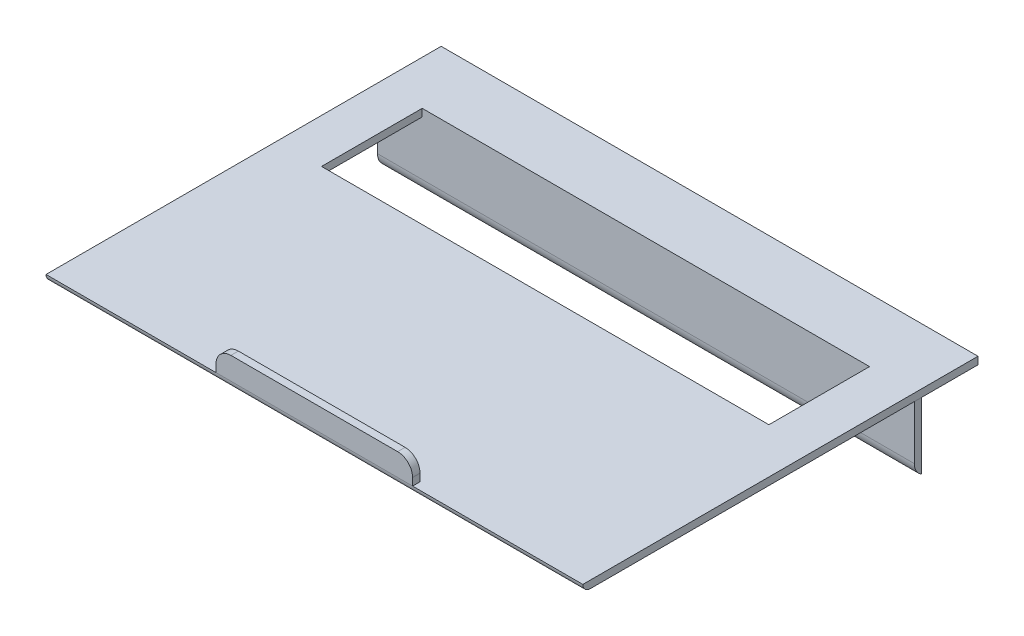
ISO-10303-21;
HEADER;
FILE_DESCRIPTION(('STEP AP214'),'2;1');
FILE_NAME('part.step','',(''),(''),'','','');
FILE_SCHEMA(('AUTOMOTIVE_DESIGN { 1 0 10303 214 1 1 1 1 }'));
ENDSEC;
DATA;
#1=APPLICATION_CONTEXT('core data for automotive mechanical design processes');
#2=APPLICATION_PROTOCOL_DEFINITION('international standard','automotive_design',2000,#1);
#3=PRODUCT_CONTEXT('',#1,'mechanical');
#4=PRODUCT('Part','Part','',(#3));
#5=PRODUCT_RELATED_PRODUCT_CATEGORY('part','',(#4));
#6=PRODUCT_DEFINITION_FORMATION('','',#4);
#7=PRODUCT_DEFINITION_CONTEXT('part definition',#1,'design');
#8=PRODUCT_DEFINITION('design','',#6,#7);
#9=PRODUCT_DEFINITION_SHAPE('','',#8);
#10=(LENGTH_UNIT() NAMED_UNIT(*) SI_UNIT(.MILLI.,.METRE.));
#11=(NAMED_UNIT(*) PLANE_ANGLE_UNIT() SI_UNIT($,.RADIAN.));
#12=(NAMED_UNIT(*) SI_UNIT($,.STERADIAN.) SOLID_ANGLE_UNIT());
#13=UNCERTAINTY_MEASURE_WITH_UNIT(LENGTH_MEASURE(1.E-05),#10,'distance_accuracy_value','');
#14=(GEOMETRIC_REPRESENTATION_CONTEXT(3) GLOBAL_UNCERTAINTY_ASSIGNED_CONTEXT((#13)) GLOBAL_UNIT_ASSIGNED_CONTEXT((#10,
#11,#12)) REPRESENTATION_CONTEXT('',''));
#15=CARTESIAN_POINT('',(0.,0.,0.));
#16=DIRECTION('',(0.,0.,1.));
#17=DIRECTION('',(1.,0.,0.));
#18=AXIS2_PLACEMENT_3D('',#15,#16,#17);
#19=CARTESIAN_POINT('',(0.0271641395676205,-1.19078061342355,2.95499944397179));
#20=DIRECTION('',(0.,-1.,0.));
#21=DIRECTION('',(0.,0.,-1.));
#22=AXIS2_PLACEMENT_3D('',#19,#20,#21);
#23=PLANE('',#22);
#24=DIRECTION('',(0.,0.,1.));
#25=VECTOR('',#24,1.);
#26=CARTESIAN_POINT('',(149.686441514181,-1.19078061342355,-94.66392061261));
#27=LINE('',#26,#25);
#28=CARTESIAN_POINT('',(149.686441514181,-1.19078061342355,-89.66392061261));
#29=VERTEX_POINT('',#28);
#30=CARTESIAN_POINT('',(149.686441514181,-1.19078061342355,-22.16392061261));
#31=VERTEX_POINT('',#30);
#32=EDGE_CURVE('E295',#29,#31,#27,.T.);
#33=ORIENTED_EDGE('',*,*,#32,.F.);
#34=DIRECTION('',(-1.,0.,0.));
#35=VECTOR('',#34,1.);
#36=CARTESIAN_POINT('',(179.686441514181,-1.19078061342355,-89.66392061261));
#37=LINE('',#36,#35);
#38=CARTESIAN_POINT('',(179.686441514181,-1.19078061342355,-89.66392061261));
#39=VERTEX_POINT('',#38);
#40=EDGE_CURVE('E195',#39,#29,#37,.T.);
#41=ORIENTED_EDGE('',*,*,#40,.F.);
#42=DIRECTION('',(0.,0.,1.));
#43=VECTOR('',#42,1.);
#44=CARTESIAN_POINT('',(179.686441514181,-1.19078061342355,-89.66392061261));
#45=LINE('',#44,#43);
#46=CARTESIAN_POINT('',(179.686441514181,-1.19078061342355,-94.66392061261));
#47=VERTEX_POINT('',#46);
#48=EDGE_CURVE('E191',#47,#39,#45,.T.);
#49=ORIENTED_EDGE('',*,*,#48,.F.);
#50=DIRECTION('',(-1.,0.,0.));
#51=VECTOR('',#50,1.);
#52=CARTESIAN_POINT('',(149.686441514181,-1.19078061342355,-94.66392061261));
#53=LINE('',#52,#51);
#54=CARTESIAN_POINT('',(-179.972835860433,-1.19078061342355,-94.66392061261));
#55=VERTEX_POINT('',#54);
#56=EDGE_CURVE('E188',#47,#55,#53,.T.);
#57=ORIENTED_EDGE('',*,*,#56,.T.);
#58=DIRECTION('',(0.,0.,1.));
#59=VECTOR('',#58,1.);
#60=CARTESIAN_POINT('',(-179.972835860433,-1.19078061342355,127.954999443972));
#61=LINE('',#60,#59);
#62=CARTESIAN_POINT('',(-179.972835860433,-1.19078061342355,-132.045000556028));
#63=VERTEX_POINT('',#62);
#64=EDGE_CURVE('E325',#63,#55,#61,.T.);
#65=ORIENTED_EDGE('',*,*,#64,.F.);
#66=DIRECTION('',(-1.,0.,0.));
#67=VECTOR('',#66,1.);
#68=CARTESIAN_POINT('',(-179.972835860433,-1.19078061342355,-132.045000556028));
#69=LINE('',#68,#67);
#70=CARTESIAN_POINT('',(180.027164139568,-1.19078061342355,-132.045000556028));
#71=VERTEX_POINT('',#70);
#72=EDGE_CURVE('E237',#71,#63,#69,.T.);
#73=ORIENTED_EDGE('',*,*,#72,.F.);
#74=DIRECTION('',(0.,0.,-1.));
#75=VECTOR('',#74,1.);
#76=CARTESIAN_POINT('',(180.027164139568,-1.19078061342355,127.954999443972));
#77=LINE('',#76,#75);
#78=CARTESIAN_POINT('',(180.027164139568,-1.19078061342355,127.954999443972));
#79=VERTEX_POINT('',#78);
#80=EDGE_CURVE('E317',#79,#71,#77,.T.);
#81=ORIENTED_EDGE('',*,*,#80,.F.);
#82=DIRECTION('',(1.,0.,0.));
#83=VECTOR('',#82,1.);
#84=CARTESIAN_POINT('',(-37.8603572812143,-1.19078061342355,127.954999443972));
#85=LINE('',#84,#83);
#86=CARTESIAN_POINT('',(-179.972835860433,-1.19078061342355,127.954999443972));
#87=VERTEX_POINT('',#86);
#88=EDGE_CURVE('E274',#87,#79,#85,.T.);
#89=ORIENTED_EDGE('',*,*,#88,.F.);
#90=CARTESIAN_POINT('',(-179.972835860433,-1.19078061342355,-89.66392061261));
#91=VERTEX_POINT('',#90);
#92=EDGE_CURVE('E335',#91,#87,#61,.T.);
#93=ORIENTED_EDGE('',*,*,#92,.F.);
#94=DIRECTION('',(1.,0.,0.));
#95=VECTOR('',#94,1.);
#96=CARTESIAN_POINT('',(-180.313558485819,-1.19078061342355,-89.66392061261));
#97=LINE('',#96,#95);
#98=CARTESIAN_POINT('',(-150.313558485819,-1.19078061342355,-89.66392061261));
#99=VERTEX_POINT('',#98);
#100=EDGE_CURVE('E216',#91,#99,#97,.T.);
#101=ORIENTED_EDGE('',*,*,#100,.T.);
#102=DIRECTION('',(0.,0.,1.));
#103=VECTOR('',#102,1.);
#104=CARTESIAN_POINT('',(-150.313558485819,-1.19078061342355,-94.66392061261));
#105=LINE('',#104,#103);
#106=CARTESIAN_POINT('',(-150.313558485819,-1.19078061342355,-22.16392061261));
#107=VERTEX_POINT('',#106);
#108=EDGE_CURVE('E305',#99,#107,#105,.T.);
#109=ORIENTED_EDGE('',*,*,#108,.T.);
#110=DIRECTION('',(-1.,0.,0.));
#111=VECTOR('',#110,1.);
#112=CARTESIAN_POINT('',(149.686441514181,-1.19078061342355,-22.16392061261));
#113=LINE('',#112,#111);
#114=EDGE_CURVE('E288',#31,#107,#113,.T.);
#115=ORIENTED_EDGE('',*,*,#114,.F.);
#116=EDGE_LOOP('',(#33,#41,#49,#57,#65,#73,#81,#89,#93,#101,#109,#115));
#117=FACE_BOUND('',#116,.T.);
#118=ADVANCED_FACE('F41',(#117),#23,.T.);
#119=CARTESIAN_POINT('',(0.0271641395676205,-1.19078061342355,132.954999443972));
#120=DIRECTION('',(0.,0.,1.));
#121=DIRECTION('',(1.,0.,0.));
#122=AXIS2_PLACEMENT_3D('',#119,#120,#121);
#123=PLANE('',#122);
#124=DIRECTION('',(1.,0.,0.));
#125=VECTOR('',#124,1.);
#126=CARTESIAN_POINT('',(-65.9736575823655,18.8092193865765,132.954999443972));
#127=LINE('',#126,#125);
#128=CARTESIAN_POINT('',(-55.9736575823655,18.8092193865765,132.954999443972));
#129=VERTEX_POINT('',#128);
#130=CARTESIAN_POINT('',(55.8576245488075,18.8092193865765,132.954999443972));
#131=VERTEX_POINT('',#130);
#132=EDGE_CURVE('E241',#129,#131,#127,.T.);
#133=ORIENTED_EDGE('',*,*,#132,.F.);
#134=CARTESIAN_POINT('',(-55.9736575823655,8.80921938657645,132.954999443972));
#135=DIRECTION('',(0.,0.,1.));
#136=DIRECTION('',(1.,0.,0.));
#137=AXIS2_PLACEMENT_3D('',#134,#135,#136);
#138=CIRCLE('',#137,10.);
#139=CARTESIAN_POINT('',(-65.9736575823655,8.80921938657645,132.954999443972));
#140=VERTEX_POINT('',#139);
#141=EDGE_CURVE('E368',#129,#140,#138,.T.);
#142=ORIENTED_EDGE('',*,*,#141,.T.);
#143=DIRECTION('',(0.,1.,0.));
#144=VECTOR('',#143,1.);
#145=CARTESIAN_POINT('',(-65.9736575823655,3.80921938657645,132.954999443972));
#146=LINE('',#145,#144);
#147=CARTESIAN_POINT('',(-65.9736575823655,3.80921938657645,132.954999443972));
#148=VERTEX_POINT('',#147);
#149=EDGE_CURVE('E253',#148,#140,#146,.T.);
#150=ORIENTED_EDGE('',*,*,#149,.F.);
#151=DIRECTION('',(1.,0.,0.));
#152=VECTOR('',#151,1.);
#153=CARTESIAN_POINT('',(0.0271641395676205,3.80921938657645,132.954999443972));
#154=LINE('',#153,#152);
#155=CARTESIAN_POINT('',(65.8576245488075,3.80921938657645,132.954999443972));
#156=VERTEX_POINT('',#155);
#157=EDGE_CURVE('E332',#148,#156,#154,.T.);
#158=ORIENTED_EDGE('',*,*,#157,.T.);
#159=DIRECTION('',(0.,-1.,0.));
#160=VECTOR('',#159,1.);
#161=CARTESIAN_POINT('',(65.8576245488075,8.80921938657645,132.954999443972));
#162=LINE('',#161,#160);
#163=CARTESIAN_POINT('',(65.8576245488075,8.80921938657645,132.954999443972));
#164=VERTEX_POINT('',#163);
#165=EDGE_CURVE('E267',#164,#156,#162,.T.);
#166=ORIENTED_EDGE('',*,*,#165,.F.);
#167=CARTESIAN_POINT('',(55.8576245488074,8.80921938657645,132.954999443972));
#168=DIRECTION('',(0.,0.,1.));
#169=DIRECTION('',(1.,0.,0.));
#170=AXIS2_PLACEMENT_3D('',#167,#168,#169);
#171=CIRCLE('',#170,10.);
#172=EDGE_CURVE('E360',#164,#131,#171,.T.);
#173=ORIENTED_EDGE('',*,*,#172,.T.);
#174=EDGE_LOOP('',(#133,#142,#150,#158,#166,#173));
#175=FACE_BOUND('',#174,.T.);
#176=ADVANCED_FACE('F411',(#175),#123,.T.);
#177=CARTESIAN_POINT('',(0.0271641395676205,-1.19078061342355,127.954999443972));
#178=DIRECTION('',(0.,0.,1.));
#179=DIRECTION('',(1.,0.,0.));
#180=AXIS2_PLACEMENT_3D('',#177,#178,#179);
#181=PLANE('',#180);
#182=DIRECTION('',(0.,1.,0.));
#183=VECTOR('',#182,1.);
#184=CARTESIAN_POINT('',(-65.9736575823655,3.80921938657645,127.954999443972));
#185=LINE('',#184,#183);
#186=CARTESIAN_POINT('',(-65.9736575823655,3.80921938657645,127.954999443972));
#187=VERTEX_POINT('',#186);
#188=CARTESIAN_POINT('',(-65.9736575823655,8.80921938657645,127.954999443972));
#189=VERTEX_POINT('',#188);
#190=EDGE_CURVE('E252',#187,#189,#185,.T.);
#191=ORIENTED_EDGE('',*,*,#190,.T.);
#192=CARTESIAN_POINT('',(-55.9736575823655,8.80921938657645,127.954999443972));
#193=DIRECTION('',(0.,0.,1.));
#194=DIRECTION('',(1.,0.,0.));
#195=AXIS2_PLACEMENT_3D('',#192,#193,#194);
#196=CIRCLE('',#195,10.);
#197=CARTESIAN_POINT('',(-55.9736575823655,18.8092193865765,127.954999443972));
#198=VERTEX_POINT('',#197);
#199=EDGE_CURVE('E374',#189,#198,#196,.F.);
#200=ORIENTED_EDGE('',*,*,#199,.T.);
#201=DIRECTION('',(-1.,0.,0.));
#202=VECTOR('',#201,1.);
#203=CARTESIAN_POINT('',(-65.9736575823655,18.8092193865765,127.954999443972));
#204=LINE('',#203,#202);
#205=CARTESIAN_POINT('',(55.8576245488075,18.8092193865765,127.954999443972));
#206=VERTEX_POINT('',#205);
#207=EDGE_CURVE('E244',#206,#198,#204,.T.);
#208=ORIENTED_EDGE('',*,*,#207,.F.);
#209=CARTESIAN_POINT('',(55.8576245488074,8.80921938657645,127.954999443972));
#210=DIRECTION('',(0.,0.,1.));
#211=DIRECTION('',(1.,0.,0.));
#212=AXIS2_PLACEMENT_3D('',#209,#210,#211);
#213=CIRCLE('',#212,10.);
#214=CARTESIAN_POINT('',(65.8576245488075,8.80921938657645,127.954999443972));
#215=VERTEX_POINT('',#214);
#216=EDGE_CURVE('E354',#206,#215,#213,.F.);
#217=ORIENTED_EDGE('',*,*,#216,.T.);
#218=DIRECTION('',(0.,-1.,0.));
#219=VECTOR('',#218,1.);
#220=CARTESIAN_POINT('',(65.8576245488075,8.80921938657645,127.954999443972));
#221=LINE('',#220,#219);
#222=CARTESIAN_POINT('',(65.8576245488075,3.80921938657645,127.954999443972));
#223=VERTEX_POINT('',#222);
#224=EDGE_CURVE('E264',#215,#223,#221,.T.);
#225=ORIENTED_EDGE('',*,*,#224,.T.);
#226=DIRECTION('',(1.,0.,0.));
#227=VECTOR('',#226,1.);
#228=CARTESIAN_POINT('',(-179.972835860433,3.80921938657645,127.954999443972));
#229=LINE('',#228,#227);
#230=EDGE_CURVE('E328',#187,#223,#229,.T.);
#231=ORIENTED_EDGE('',*,*,#230,.F.);
#232=EDGE_LOOP('',(#191,#200,#208,#217,#225,#231));
#233=FACE_BOUND('',#232,.T.);
#234=ADVANCED_FACE('F441',(#233),#181,.F.);
#235=CARTESIAN_POINT('',(180.027164139568,3.80921938657645,127.954999443972));
#236=DIRECTION('',(-1.,0.,0.));
#237=DIRECTION('',(0.,0.,1.));
#238=AXIS2_PLACEMENT_3D('',#235,#236,#237);
#239=PLANE('',#238);
#240=DIRECTION('',(0.,0.,-1.));
#241=VECTOR('',#240,1.);
#242=CARTESIAN_POINT('',(180.027164139568,3.80921938657645,127.954999443972));
#243=LINE('',#242,#241);
#244=CARTESIAN_POINT('',(180.027164139568,3.80921938657645,132.954999443972));
#245=VERTEX_POINT('',#244);
#246=CARTESIAN_POINT('',(180.027164139568,3.80921938657645,-132.045000556028));
#247=VERTEX_POINT('',#246);
#248=EDGE_CURVE('E321',#245,#247,#243,.T.);
#249=ORIENTED_EDGE('',*,*,#248,.F.);
#250=CARTESIAN_POINT('',(180.027164139568,3.80921938657645,127.954999443972));
#251=DIRECTION('',(-1.,0.,0.));
#252=DIRECTION('',(0.,0.,1.));
#253=AXIS2_PLACEMENT_3D('',#250,#251,#252);
#254=CIRCLE('',#253,5.);
#255=EDGE_CURVE('E342',#245,#79,#254,.F.);
#256=ORIENTED_EDGE('',*,*,#255,.T.);
#257=ORIENTED_EDGE('',*,*,#80,.T.);
#258=DIRECTION('',(0.,-1.,0.));
#259=VECTOR('',#258,1.);
#260=CARTESIAN_POINT('',(180.027164139568,3.80921938657645,-132.045000556028));
#261=LINE('',#260,#259);
#262=EDGE_CURVE('E233',#247,#71,#261,.T.);
#263=ORIENTED_EDGE('',*,*,#262,.F.);
#264=EDGE_LOOP('',(#249,#256,#257,#263));
#265=FACE_BOUND('',#264,.T.);
#266=ADVANCED_FACE('F443',(#265),#239,.F.);
#267=CARTESIAN_POINT('',(-179.972835860433,3.80921938657645,127.954999443972));
#268=DIRECTION('',(1.,0.,0.));
#269=DIRECTION('',(0.,0.,-1.));
#270=AXIS2_PLACEMENT_3D('',#267,#268,#269);
#271=PLANE('',#270);
#272=CARTESIAN_POINT('',(-179.972835860433,3.80921938657645,127.954999443972));
#273=DIRECTION('',(1.,0.,0.));
#274=DIRECTION('',(0.,0.,-1.));
#275=AXIS2_PLACEMENT_3D('',#272,#273,#274);
#276=CIRCLE('',#275,5.);
#277=CARTESIAN_POINT('',(-179.972835860433,3.80921938657645,132.954999443972));
#278=VERTEX_POINT('',#277);
#279=EDGE_CURVE('E346',#87,#278,#276,.F.);
#280=ORIENTED_EDGE('',*,*,#279,.T.);
#281=DIRECTION('',(0.,0.,1.));
#282=VECTOR('',#281,1.);
#283=CARTESIAN_POINT('',(-179.972835860433,3.80921938657645,127.954999443972));
#284=LINE('',#283,#282);
#285=CARTESIAN_POINT('',(-179.972835860433,3.80921938657645,-132.045000556028));
#286=VERTEX_POINT('',#285);
#287=EDGE_CURVE('E324',#286,#278,#284,.T.);
#288=ORIENTED_EDGE('',*,*,#287,.F.);
#289=DIRECTION('',(0.,1.,0.));
#290=VECTOR('',#289,1.);
#291=CARTESIAN_POINT('',(-179.972835860433,3.80921938657645,-132.045000556028));
#292=LINE('',#291,#290);
#293=EDGE_CURVE('E225',#63,#286,#292,.T.);
#294=ORIENTED_EDGE('',*,*,#293,.F.);
#295=ORIENTED_EDGE('',*,*,#64,.T.);
#296=DIRECTION('',(0.,0.,-1.));
#297=VECTOR('',#296,1.);
#298=CARTESIAN_POINT('',(-179.972835860433,-1.19078061342355,127.954999443972));
#299=LINE('',#298,#297);
#300=EDGE_CURVE('E221',#91,#55,#299,.T.);
#301=ORIENTED_EDGE('',*,*,#300,.F.);
#302=ORIENTED_EDGE('',*,*,#92,.T.);
#303=EDGE_LOOP('',(#280,#288,#294,#295,#301,#302));
#304=FACE_BOUND('',#303,.T.);
#305=ADVANCED_FACE('F395',(#304),#271,.F.);
#306=CARTESIAN_POINT('',(0.0271641395676205,3.80921938657645,2.95499944397179));
#307=DIRECTION('',(0.,-1.,0.));
#308=DIRECTION('',(0.,0.,-1.));
#309=AXIS2_PLACEMENT_3D('',#306,#307,#308);
#310=PLANE('',#309);
#311=DIRECTION('',(0.,0.,-1.));
#312=VECTOR('',#311,1.);
#313=CARTESIAN_POINT('',(-65.9736575823655,3.80921938657645,127.954999443972));
#314=LINE('',#313,#312);
#315=EDGE_CURVE('E248',#148,#187,#314,.T.);
#316=ORIENTED_EDGE('',*,*,#315,.T.);
#317=ORIENTED_EDGE('',*,*,#230,.T.);
#318=DIRECTION('',(0.,0.,1.));
#319=VECTOR('',#318,1.);
#320=CARTESIAN_POINT('',(65.8576245488075,3.80921938657645,127.954999443972));
#321=LINE('',#320,#319);
#322=EDGE_CURVE('E257',#223,#156,#321,.T.);
#323=ORIENTED_EDGE('',*,*,#322,.T.);
#324=DIRECTION('',(1.,0.,0.));
#325=VECTOR('',#324,1.);
#326=CARTESIAN_POINT('',(93.8005635372653,3.80921938657645,132.954999443972));
#327=LINE('',#326,#325);
#328=EDGE_CURVE('E270',#156,#245,#327,.T.);
#329=ORIENTED_EDGE('',*,*,#328,.T.);
#330=ORIENTED_EDGE('',*,*,#248,.T.);
#331=DIRECTION('',(1.,0.,0.));
#332=VECTOR('',#331,1.);
#333=CARTESIAN_POINT('',(-179.972835860433,3.80921938657645,-132.045000556028));
#334=LINE('',#333,#332);
#335=EDGE_CURVE('E229',#286,#247,#334,.T.);
#336=ORIENTED_EDGE('',*,*,#335,.F.);
#337=ORIENTED_EDGE('',*,*,#287,.T.);
#338=EDGE_CURVE('E339',#278,#148,#154,.T.);
#339=ORIENTED_EDGE('',*,*,#338,.T.);
#340=EDGE_LOOP('',(#316,#317,#323,#329,#330,#336,#337,#339));
#341=FACE_BOUND('',#340,.T.);
#342=DIRECTION('',(0.,0.,1.));
#343=VECTOR('',#342,1.);
#344=CARTESIAN_POINT('',(-150.313558485819,3.80921938657645,-94.66392061261));
#345=LINE('',#344,#343);
#346=CARTESIAN_POINT('',(-150.313558485819,3.80921938657645,-89.66392061261));
#347=VERTEX_POINT('',#346);
#348=CARTESIAN_POINT('',(-150.313558485819,3.80921938657645,-22.16392061261));
#349=VERTEX_POINT('',#348);
#350=EDGE_CURVE('E294',#347,#349,#345,.T.);
#351=ORIENTED_EDGE('',*,*,#350,.F.);
#352=DIRECTION('',(-1.,0.,0.));
#353=VECTOR('',#352,1.);
#354=CARTESIAN_POINT('',(-150.313558485819,3.80921938657645,-89.66392061261));
#355=LINE('',#354,#353);
#356=CARTESIAN_POINT('',(149.686441514181,3.80921938657645,-89.66392061261));
#357=VERTEX_POINT('',#356);
#358=EDGE_CURVE('E285',#357,#347,#355,.T.);
#359=ORIENTED_EDGE('',*,*,#358,.F.);
#360=DIRECTION('',(0.,0.,1.));
#361=VECTOR('',#360,1.);
#362=CARTESIAN_POINT('',(149.686441514181,3.80921938657645,-94.66392061261));
#363=LINE('',#362,#361);
#364=CARTESIAN_POINT('',(149.686441514181,3.80921938657645,-22.16392061261));
#365=VERTEX_POINT('',#364);
#366=EDGE_CURVE('E299',#357,#365,#363,.T.);
#367=ORIENTED_EDGE('',*,*,#366,.T.);
#368=DIRECTION('',(-1.,0.,0.));
#369=VECTOR('',#368,1.);
#370=CARTESIAN_POINT('',(149.686441514181,3.80921938657645,-22.16392061261));
#371=LINE('',#370,#369);
#372=EDGE_CURVE('E291',#365,#349,#371,.T.);
#373=ORIENTED_EDGE('',*,*,#372,.T.);
#374=EDGE_LOOP('',(#351,#359,#367,#373));
#375=FACE_BOUND('',#374,.T.);
#376=ADVANCED_FACE('F419',(#341,#375),#310,.F.);
#377=CARTESIAN_POINT('',(149.686441514181,3.80921938657645,-22.16392061261));
#378=DIRECTION('',(0.,0.,1.));
#379=DIRECTION('',(1.,0.,0.));
#380=AXIS2_PLACEMENT_3D('',#377,#378,#379);
#381=PLANE('',#380);
#382=ORIENTED_EDGE('',*,*,#114,.T.);
#383=DIRECTION('',(0.,-1.,0.));
#384=VECTOR('',#383,1.);
#385=CARTESIAN_POINT('',(-150.313558485819,3.80921938657645,-22.16392061261));
#386=LINE('',#385,#384);
#387=EDGE_CURVE('E302',#349,#107,#386,.T.);
#388=ORIENTED_EDGE('',*,*,#387,.F.);
#389=ORIENTED_EDGE('',*,*,#372,.F.);
#390=DIRECTION('',(0.,-1.,0.));
#391=VECTOR('',#390,1.);
#392=CARTESIAN_POINT('',(149.686441514181,3.80921938657645,-22.16392061261));
#393=LINE('',#392,#391);
#394=EDGE_CURVE('E313',#365,#31,#393,.T.);
#395=ORIENTED_EDGE('',*,*,#394,.T.);
#396=EDGE_LOOP('',(#382,#388,#389,#395));
#397=FACE_BOUND('',#396,.T.);
#398=ADVANCED_FACE('F491',(#397),#381,.F.);
#399=CARTESIAN_POINT('',(149.686441514181,3.80921938657645,-94.66392061261));
#400=DIRECTION('',(1.,0.,0.));
#401=DIRECTION('',(0.,0.,-1.));
#402=AXIS2_PLACEMENT_3D('',#399,#400,#401);
#403=PLANE('',#402);
#404=ORIENTED_EDGE('',*,*,#366,.F.);
#405=DIRECTION('',(0.,1.,0.));
#406=VECTOR('',#405,1.);
#407=CARTESIAN_POINT('',(149.686441514181,3.80921938657645,-89.66392061261));
#408=LINE('',#407,#406);
#409=EDGE_CURVE('E281',#29,#357,#408,.T.);
#410=ORIENTED_EDGE('',*,*,#409,.F.);
#411=ORIENTED_EDGE('',*,*,#32,.T.);
#412=ORIENTED_EDGE('',*,*,#394,.F.);
#413=EDGE_LOOP('',(#404,#410,#411,#412));
#414=FACE_BOUND('',#413,.T.);
#415=ADVANCED_FACE('F488',(#414),#403,.F.);
#416=CARTESIAN_POINT('',(-150.313558485819,3.80921938657645,-94.66392061261));
#417=DIRECTION('',(1.,0.,0.));
#418=DIRECTION('',(0.,0.,-1.));
#419=AXIS2_PLACEMENT_3D('',#416,#417,#418);
#420=PLANE('',#419);
#421=DIRECTION('',(0.,-1.,0.));
#422=VECTOR('',#421,1.);
#423=CARTESIAN_POINT('',(-150.313558485819,3.80921938657645,-89.66392061261));
#424=LINE('',#423,#422);
#425=EDGE_CURVE('E277',#347,#99,#424,.T.);
#426=ORIENTED_EDGE('',*,*,#425,.F.);
#427=ORIENTED_EDGE('',*,*,#350,.T.);
#428=ORIENTED_EDGE('',*,*,#387,.T.);
#429=ORIENTED_EDGE('',*,*,#108,.F.);
#430=EDGE_LOOP('',(#426,#427,#428,#429));
#431=FACE_BOUND('',#430,.T.);
#432=ADVANCED_FACE('F485',(#431),#420,.T.);
#433=CARTESIAN_POINT('',(0.0271641395676205,-1.19078061342355,-89.66392061261));
#434=DIRECTION('',(0.,0.,1.));
#435=DIRECTION('',(1.,0.,0.));
#436=AXIS2_PLACEMENT_3D('',#433,#434,#435);
#437=PLANE('',#436);
#438=DIRECTION('',(0.,1.,0.));
#439=VECTOR('',#438,1.);
#440=CARTESIAN_POINT('',(-180.313558485819,-1.19078061342355,-89.66392061261));
#441=LINE('',#440,#439);
#442=CARTESIAN_POINT('',(-180.313558485819,-37.5305265755792,-89.66392061261));
#443=VERTEX_POINT('',#442);
#444=CARTESIAN_POINT('',(-180.313558485819,-1.19078061342355,-89.66392061261));
#445=VERTEX_POINT('',#444);
#446=EDGE_CURVE('E194',#443,#445,#441,.T.);
#447=ORIENTED_EDGE('',*,*,#446,.F.);
#448=DIRECTION('',(-1.,0.,0.));
#449=VECTOR('',#448,1.);
#450=CARTESIAN_POINT('',(179.686441514181,-37.5305265755792,-89.66392061261));
#451=LINE('',#450,#449);
#452=CARTESIAN_POINT('',(179.686441514181,-37.5305265755792,-89.66392061261));
#453=VERTEX_POINT('',#452);
#454=EDGE_CURVE('E50',#443,#453,#451,.F.);
#455=ORIENTED_EDGE('',*,*,#454,.T.);
#456=DIRECTION('',(0.,-1.,0.));
#457=VECTOR('',#456,1.);
#458=CARTESIAN_POINT('',(179.686441514181,-1.19078061342355,-89.66392061261));
#459=LINE('',#458,#457);
#460=EDGE_CURVE('E183',#39,#453,#459,.T.);
#461=ORIENTED_EDGE('',*,*,#460,.F.);
#462=ORIENTED_EDGE('',*,*,#40,.T.);
#463=ORIENTED_EDGE('',*,*,#409,.T.);
#464=ORIENTED_EDGE('',*,*,#358,.T.);
#465=ORIENTED_EDGE('',*,*,#425,.T.);
#466=ORIENTED_EDGE('',*,*,#100,.F.);
#467=EDGE_CURVE('E217',#445,#91,#97,.T.);
#468=ORIENTED_EDGE('',*,*,#467,.F.);
#469=EDGE_LOOP('',(#447,#455,#461,#462,#463,#464,#465,#466,#468));
#470=FACE_BOUND('',#469,.T.);
#471=ADVANCED_FACE('F382',(#470),#437,.T.);
#472=CARTESIAN_POINT('',(0.0271641395676205,-1.19078061342355,-94.66392061261));
#473=DIRECTION('',(0.,0.,1.));
#474=DIRECTION('',(1.,0.,0.));
#475=AXIS2_PLACEMENT_3D('',#472,#473,#474);
#476=PLANE('',#475);
#477=ORIENTED_EDGE('',*,*,#56,.F.);
#478=DIRECTION('',(0.,1.,0.));
#479=VECTOR('',#478,1.);
#480=CARTESIAN_POINT('',(179.686441514181,-1.19078061342355,-94.66392061261));
#481=LINE('',#480,#479);
#482=CARTESIAN_POINT('',(179.686441514181,-46.1907806134236,-94.66392061261));
#483=VERTEX_POINT('',#482);
#484=EDGE_CURVE('E181',#483,#47,#481,.T.);
#485=ORIENTED_EDGE('',*,*,#484,.F.);
#486=DIRECTION('',(-1.,0.,0.));
#487=VECTOR('',#486,1.);
#488=CARTESIAN_POINT('',(179.686441514181,-46.1907806134236,-94.66392061261));
#489=LINE('',#488,#487);
#490=CARTESIAN_POINT('',(149.686441514181,-46.1907806134236,-94.66392061261));
#491=VERTEX_POINT('',#490);
#492=EDGE_CURVE('E186',#483,#491,#489,.T.);
#493=ORIENTED_EDGE('',*,*,#492,.T.);
#494=DIRECTION('',(1.,0.,0.));
#495=VECTOR('',#494,1.);
#496=CARTESIAN_POINT('',(-150.313558485819,-46.1907806134236,-94.66392061261));
#497=LINE('',#496,#495);
#498=CARTESIAN_POINT('',(-150.313558485819,-46.1907806134236,-94.66392061261));
#499=VERTEX_POINT('',#498);
#500=EDGE_CURVE('E57',#499,#491,#497,.T.);
#501=ORIENTED_EDGE('',*,*,#500,.F.);
#502=DIRECTION('',(1.,0.,0.));
#503=VECTOR('',#502,1.);
#504=CARTESIAN_POINT('',(-180.313558485819,-46.1907806134236,-94.66392061261));
#505=LINE('',#504,#503);
#506=CARTESIAN_POINT('',(-180.313558485819,-46.1907806134236,-94.66392061261));
#507=VERTEX_POINT('',#506);
#508=EDGE_CURVE('E210',#507,#499,#505,.T.);
#509=ORIENTED_EDGE('',*,*,#508,.F.);
#510=DIRECTION('',(0.,-1.,0.));
#511=VECTOR('',#510,1.);
#512=CARTESIAN_POINT('',(-180.313558485819,-1.19078061342355,-94.66392061261));
#513=LINE('',#512,#511);
#514=CARTESIAN_POINT('',(-180.313558485819,-1.19078061342355,-94.66392061261));
#515=VERTEX_POINT('',#514);
#516=EDGE_CURVE('E207',#515,#507,#513,.T.);
#517=ORIENTED_EDGE('',*,*,#516,.F.);
#518=DIRECTION('',(1.,0.,0.));
#519=VECTOR('',#518,1.);
#520=CARTESIAN_POINT('',(-180.313558485819,-1.19078061342355,-94.66392061261));
#521=LINE('',#520,#519);
#522=EDGE_CURVE('E213',#515,#55,#521,.T.);
#523=ORIENTED_EDGE('',*,*,#522,.T.);
#524=EDGE_LOOP('',(#477,#485,#493,#501,#509,#517,#523));
#525=FACE_BOUND('',#524,.T.);
#526=ADVANCED_FACE('F185',(#525),#476,.F.);
#527=CARTESIAN_POINT('',(0.0271641395676205,3.80921938657645,127.954999443972));
#528=DIRECTION('',(1.,0.,0.));
#529=DIRECTION('',(0.,0.,-1.));
#530=AXIS2_PLACEMENT_3D('',#527,#528,#529);
#531=CYLINDRICAL_SURFACE('',#530,5.);
#532=ORIENTED_EDGE('',*,*,#88,.T.);
#533=ORIENTED_EDGE('',*,*,#255,.F.);
#534=ORIENTED_EDGE('',*,*,#328,.F.);
#535=ORIENTED_EDGE('',*,*,#157,.F.);
#536=ORIENTED_EDGE('',*,*,#338,.F.);
#537=ORIENTED_EDGE('',*,*,#279,.F.);
#538=EDGE_LOOP('',(#532,#533,#534,#535,#536,#537));
#539=FACE_BOUND('',#538,.T.);
#540=ADVANCED_FACE('F416',(#539),#531,.T.);
#541=CARTESIAN_POINT('',(65.8576245488075,8.80921938657645,127.954999443972));
#542=DIRECTION('',(1.,0.,0.));
#543=DIRECTION('',(0.,0.,-1.));
#544=AXIS2_PLACEMENT_3D('',#541,#542,#543);
#545=PLANE('',#544);
#546=ORIENTED_EDGE('',*,*,#224,.F.);
#547=DIRECTION('',(0.,0.,-1.));
#548=VECTOR('',#547,1.);
#549=CARTESIAN_POINT('',(65.8576245488075,8.80921938657645,127.954999443972));
#550=LINE('',#549,#548);
#551=EDGE_CURVE('E357',#215,#164,#550,.F.);
#552=ORIENTED_EDGE('',*,*,#551,.T.);
#553=ORIENTED_EDGE('',*,*,#165,.T.);
#554=ORIENTED_EDGE('',*,*,#322,.F.);
#555=EDGE_LOOP('',(#546,#552,#553,#554));
#556=FACE_BOUND('',#555,.T.);
#557=ADVANCED_FACE('F423',(#556),#545,.T.);
#558=CARTESIAN_POINT('',(-65.9736575823655,3.80921938657645,127.954999443972));
#559=DIRECTION('',(1.,0.,0.));
#560=DIRECTION('',(0.,0.,-1.));
#561=AXIS2_PLACEMENT_3D('',#558,#559,#560);
#562=PLANE('',#561);
#563=ORIENTED_EDGE('',*,*,#149,.T.);
#564=DIRECTION('',(0.,0.,1.));
#565=VECTOR('',#564,1.);
#566=CARTESIAN_POINT('',(-65.9736575823655,8.80921938657645,127.954999443972));
#567=LINE('',#566,#565);
#568=EDGE_CURVE('E371',#140,#189,#567,.F.);
#569=ORIENTED_EDGE('',*,*,#568,.T.);
#570=ORIENTED_EDGE('',*,*,#190,.F.);
#571=ORIENTED_EDGE('',*,*,#315,.F.);
#572=EDGE_LOOP('',(#563,#569,#570,#571));
#573=FACE_BOUND('',#572,.T.);
#574=ADVANCED_FACE('F438',(#573),#562,.F.);
#575=CARTESIAN_POINT('',(0.,18.8092193865765,0.));
#576=DIRECTION('',(0.,1.,0.));
#577=DIRECTION('',(0.,0.,1.));
#578=AXIS2_PLACEMENT_3D('',#575,#576,#577);
#579=PLANE('',#578);
#580=ORIENTED_EDGE('',*,*,#207,.T.);
#581=DIRECTION('',(0.,0.,1.));
#582=VECTOR('',#581,1.);
#583=CARTESIAN_POINT('',(-55.9736575823655,18.8092193865765,132.954999443972));
#584=LINE('',#583,#582);
#585=EDGE_CURVE('E364',#198,#129,#584,.T.);
#586=ORIENTED_EDGE('',*,*,#585,.T.);
#587=ORIENTED_EDGE('',*,*,#132,.T.);
#588=DIRECTION('',(0.,0.,-1.));
#589=VECTOR('',#588,1.);
#590=CARTESIAN_POINT('',(55.8576245488074,18.8092193865765,0.));
#591=LINE('',#590,#589);
#592=EDGE_CURVE('E350',#131,#206,#591,.T.);
#593=ORIENTED_EDGE('',*,*,#592,.T.);
#594=EDGE_LOOP('',(#580,#586,#587,#593));
#595=FACE_BOUND('',#594,.T.);
#596=ADVANCED_FACE('F429',(#595),#579,.T.);
#597=CARTESIAN_POINT('',(55.8576245488074,8.80921938657645,0.));
#598=DIRECTION('',(0.,0.,-1.));
#599=DIRECTION('',(-1.,0.,0.));
#600=AXIS2_PLACEMENT_3D('',#597,#598,#599);
#601=CYLINDRICAL_SURFACE('',#600,10.);
#602=ORIENTED_EDGE('',*,*,#172,.F.);
#603=ORIENTED_EDGE('',*,*,#551,.F.);
#604=ORIENTED_EDGE('',*,*,#216,.F.);
#605=ORIENTED_EDGE('',*,*,#592,.F.);
#606=EDGE_LOOP('',(#602,#603,#604,#605));
#607=FACE_BOUND('',#606,.T.);
#608=ADVANCED_FACE('F426',(#607),#601,.T.);
#609=CARTESIAN_POINT('',(-55.9736575823655,8.80921938657645,0.));
#610=DIRECTION('',(0.,0.,-1.));
#611=DIRECTION('',(-1.,0.,0.));
#612=AXIS2_PLACEMENT_3D('',#609,#610,#611);
#613=CYLINDRICAL_SURFACE('',#612,10.);
#614=ORIENTED_EDGE('',*,*,#199,.F.);
#615=ORIENTED_EDGE('',*,*,#568,.F.);
#616=ORIENTED_EDGE('',*,*,#141,.F.);
#617=ORIENTED_EDGE('',*,*,#585,.F.);
#618=EDGE_LOOP('',(#614,#615,#616,#617));
#619=FACE_BOUND('',#618,.T.);
#620=ADVANCED_FACE('F434',(#619),#613,.T.);
#621=CARTESIAN_POINT('',(0.,0.,-132.045000556028));
#622=DIRECTION('',(0.,0.,1.));
#623=DIRECTION('',(1.,0.,0.));
#624=AXIS2_PLACEMENT_3D('',#621,#622,#623);
#625=PLANE('',#624);
#626=ORIENTED_EDGE('',*,*,#293,.T.);
#627=ORIENTED_EDGE('',*,*,#335,.T.);
#628=ORIENTED_EDGE('',*,*,#262,.T.);
#629=ORIENTED_EDGE('',*,*,#72,.T.);
#630=EDGE_LOOP('',(#626,#627,#628,#629));
#631=FACE_BOUND('',#630,.T.);
#632=ADVANCED_FACE('F465',(#631),#625,.F.);
#633=CARTESIAN_POINT('',(-180.313558485819,-1.19078061342355,-89.66392061261));
#634=DIRECTION('',(0.,-1.,0.));
#635=DIRECTION('',(0.,0.,-1.));
#636=AXIS2_PLACEMENT_3D('',#633,#634,#635);
#637=PLANE('',#636);
#638=ORIENTED_EDGE('',*,*,#467,.T.);
#639=ORIENTED_EDGE('',*,*,#300,.T.);
#640=ORIENTED_EDGE('',*,*,#522,.F.);
#641=DIRECTION('',(0.,0.,-1.));
#642=VECTOR('',#641,1.);
#643=CARTESIAN_POINT('',(-180.313558485819,-1.19078061342355,-89.66392061261));
#644=LINE('',#643,#642);
#645=EDGE_CURVE('E199',#445,#515,#644,.T.);
#646=ORIENTED_EDGE('',*,*,#645,.F.);
#647=EDGE_LOOP('',(#638,#639,#640,#646));
#648=FACE_BOUND('',#647,.T.);
#649=ADVANCED_FACE('F391',(#648),#637,.F.);
#650=CARTESIAN_POINT('',(-180.313558485819,0.,0.));
#651=DIRECTION('',(1.,0.,0.));
#652=DIRECTION('',(0.,0.,-1.));
#653=AXIS2_PLACEMENT_3D('',#650,#651,#652);
#654=PLANE('',#653);
#655=ORIENTED_EDGE('',*,*,#516,.T.);
#656=CARTESIAN_POINT('',(-180.313558485819,-37.5305265755792,-99.66392061261));
#657=DIRECTION('',(1.,0.,0.));
#658=DIRECTION('',(0.,0.,-1.));
#659=AXIS2_PLACEMENT_3D('',#656,#657,#658);
#660=CIRCLE('',#659,10.);
#661=EDGE_CURVE('E377',#507,#443,#660,.F.);
#662=ORIENTED_EDGE('',*,*,#661,.T.);
#663=ORIENTED_EDGE('',*,*,#446,.T.);
#664=ORIENTED_EDGE('',*,*,#645,.T.);
#665=EDGE_LOOP('',(#655,#662,#663,#664));
#666=FACE_BOUND('',#665,.T.);
#667=ADVANCED_FACE('F386',(#666),#654,.F.);
#668=CARTESIAN_POINT('',(179.686441514181,0.,0.));
#669=DIRECTION('',(1.,0.,0.));
#670=DIRECTION('',(0.,0.,-1.));
#671=AXIS2_PLACEMENT_3D('',#668,#669,#670);
#672=PLANE('',#671);
#673=ORIENTED_EDGE('',*,*,#460,.T.);
#674=CARTESIAN_POINT('',(179.686441514181,-37.5305265755792,-99.66392061261));
#675=DIRECTION('',(1.,0.,0.));
#676=DIRECTION('',(0.,0.,-1.));
#677=AXIS2_PLACEMENT_3D('',#674,#675,#676);
#678=CIRCLE('',#677,10.);
#679=EDGE_CURVE('E11',#453,#483,#678,.T.);
#680=ORIENTED_EDGE('',*,*,#679,.T.);
#681=ORIENTED_EDGE('',*,*,#484,.T.);
#682=ORIENTED_EDGE('',*,*,#48,.T.);
#683=EDGE_LOOP('',(#673,#680,#681,#682));
#684=FACE_BOUND('',#683,.T.);
#685=ADVANCED_FACE('F179',(#684),#672,.T.);
#686=CARTESIAN_POINT('',(179.686441514181,-37.5305265755792,-99.66392061261));
#687=DIRECTION('',(1.,0.,0.));
#688=DIRECTION('',(0.,0.,-1.));
#689=AXIS2_PLACEMENT_3D('',#686,#687,#688);
#690=CYLINDRICAL_SURFACE('',#689,10.);
#691=ORIENTED_EDGE('',*,*,#679,.F.);
#692=ORIENTED_EDGE('',*,*,#454,.F.);
#693=ORIENTED_EDGE('',*,*,#661,.F.);
#694=ORIENTED_EDGE('',*,*,#508,.T.);
#695=ORIENTED_EDGE('',*,*,#500,.T.);
#696=ORIENTED_EDGE('',*,*,#492,.F.);
#697=EDGE_LOOP('',(#691,#692,#693,#694,#695,#696));
#698=FACE_BOUND('',#697,.T.);
#699=ADVANCED_FACE('F43',(#698),#690,.T.);
#700=CLOSED_SHELL('',(#118,#176,#234,#266,#305,#376,#398,#415,#432,#471,#526,#540,#557,#574,
#596,#608,#620,#632,#649,#667,#685,#699));
#701=MANIFOLD_SOLID_BREP('B2',#700);
#702=ADVANCED_BREP_SHAPE_REPRESENTATION('',(#18,#701),#14);
#703=SHAPE_DEFINITION_REPRESENTATION(#9,#702);
ENDSEC;
END-ISO-10303-21;
